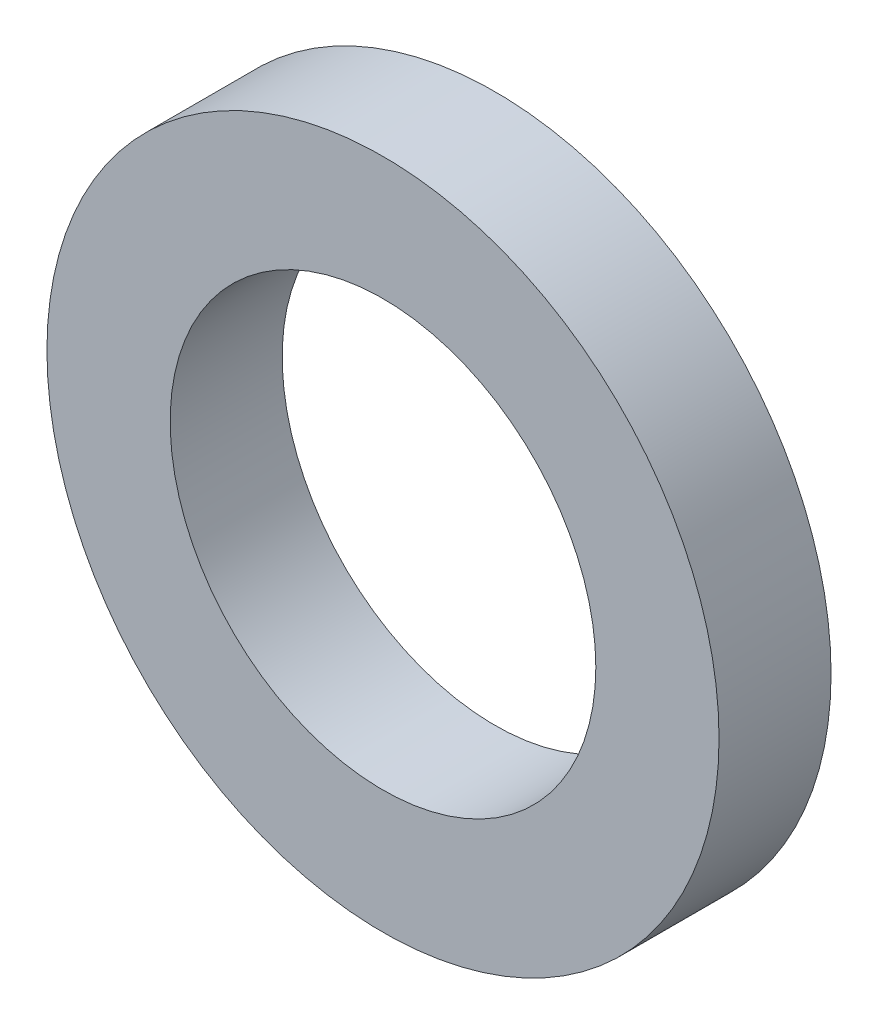
ISO-10303-21;
HEADER;
FILE_DESCRIPTION(('STEP AP214'),'2;1');
FILE_NAME('part.step','',(''),(''),'','','');
FILE_SCHEMA(('AUTOMOTIVE_DESIGN { 1 0 10303 214 1 1 1 1 }'));
ENDSEC;
DATA;
#1=APPLICATION_CONTEXT('core data for automotive mechanical design processes');
#2=APPLICATION_PROTOCOL_DEFINITION('international standard','automotive_design',2000,#1);
#3=PRODUCT_CONTEXT('',#1,'mechanical');
#4=PRODUCT('Part','Part','',(#3));
#5=PRODUCT_RELATED_PRODUCT_CATEGORY('part','',(#4));
#6=PRODUCT_DEFINITION_FORMATION('','',#4);
#7=PRODUCT_DEFINITION_CONTEXT('part definition',#1,'design');
#8=PRODUCT_DEFINITION('design','',#6,#7);
#9=PRODUCT_DEFINITION_SHAPE('','',#8);
#10=(LENGTH_UNIT() NAMED_UNIT(*) SI_UNIT(.MILLI.,.METRE.));
#11=(NAMED_UNIT(*) PLANE_ANGLE_UNIT() SI_UNIT($,.RADIAN.));
#12=(NAMED_UNIT(*) SI_UNIT($,.STERADIAN.) SOLID_ANGLE_UNIT());
#13=UNCERTAINTY_MEASURE_WITH_UNIT(LENGTH_MEASURE(1.E-05),#10,'distance_accuracy_value','');
#14=(GEOMETRIC_REPRESENTATION_CONTEXT(3) GLOBAL_UNCERTAINTY_ASSIGNED_CONTEXT((#13)) GLOBAL_UNIT_ASSIGNED_CONTEXT((#10,
#11,#12)) REPRESENTATION_CONTEXT('',''));
#15=CARTESIAN_POINT('',(0.,0.,0.));
#16=DIRECTION('',(0.,0.,1.));
#17=DIRECTION('',(1.,0.,0.));
#18=AXIS2_PLACEMENT_3D('',#15,#16,#17);
#19=CARTESIAN_POINT('',(0.,0.,1.25));
#20=DIRECTION('',(0.,0.,1.));
#21=DIRECTION('',(1.,0.,0.));
#22=AXIS2_PLACEMENT_3D('',#19,#20,#21);
#23=PLANE('',#22);
#24=CARTESIAN_POINT('',(0.,0.,1.25));
#25=DIRECTION('',(0.,0.,1.));
#26=DIRECTION('',(1.,0.,0.));
#27=AXIS2_PLACEMENT_3D('',#24,#25,#26);
#28=CIRCLE('',#27,4.5);
#29=CARTESIAN_POINT('',(4.5,0.,1.25));
#30=VERTEX_POINT('',#29);
#31=EDGE_CURVE('E10',#30,#30,#28,.T.);
#32=ORIENTED_EDGE('',*,*,#31,.T.);
#33=EDGE_LOOP('',(#32));
#34=FACE_BOUND('',#33,.T.);
#35=CARTESIAN_POINT('',(0.,0.,1.25));
#36=DIRECTION('',(0.,0.,1.));
#37=DIRECTION('',(1.,0.,0.));
#38=AXIS2_PLACEMENT_3D('',#35,#36,#37);
#39=CIRCLE('',#38,2.85);
#40=CARTESIAN_POINT('',(2.85,0.,1.25));
#41=VERTEX_POINT('',#40);
#42=EDGE_CURVE('E44',#41,#41,#39,.T.);
#43=ORIENTED_EDGE('',*,*,#42,.F.);
#44=EDGE_LOOP('',(#43));
#45=FACE_BOUND('',#44,.T.);
#46=ADVANCED_FACE('F33',(#34,#45),#23,.T.);
#47=CARTESIAN_POINT('',(0.,0.,-0.25));
#48=DIRECTION('',(0.,0.,1.));
#49=DIRECTION('',(1.,0.,0.));
#50=AXIS2_PLACEMENT_3D('',#47,#48,#49);
#51=PLANE('',#50);
#52=CARTESIAN_POINT('',(0.,0.,-0.25));
#53=DIRECTION('',(0.,0.,1.));
#54=DIRECTION('',(1.,0.,0.));
#55=AXIS2_PLACEMENT_3D('',#52,#53,#54);
#56=CIRCLE('',#55,4.5);
#57=CARTESIAN_POINT('',(4.5,0.,-0.25));
#58=VERTEX_POINT('',#57);
#59=EDGE_CURVE('E37',#58,#58,#56,.T.);
#60=ORIENTED_EDGE('',*,*,#59,.F.);
#61=EDGE_LOOP('',(#60));
#62=FACE_BOUND('',#61,.T.);
#63=CARTESIAN_POINT('',(0.,0.,-0.25));
#64=DIRECTION('',(0.,0.,1.));
#65=DIRECTION('',(1.,0.,0.));
#66=AXIS2_PLACEMENT_3D('',#63,#64,#65);
#67=CIRCLE('',#66,2.85);
#68=CARTESIAN_POINT('',(2.85,0.,-0.25));
#69=VERTEX_POINT('',#68);
#70=EDGE_CURVE('E46',#69,#69,#67,.T.);
#71=ORIENTED_EDGE('',*,*,#70,.T.);
#72=EDGE_LOOP('',(#71));
#73=FACE_BOUND('',#72,.T.);
#74=ADVANCED_FACE('F56',(#62,#73),#51,.F.);
#75=CARTESIAN_POINT('',(0.,0.,1.25));
#76=DIRECTION('',(0.,0.,-1.));
#77=DIRECTION('',(-1.,0.,0.));
#78=AXIS2_PLACEMENT_3D('',#75,#76,#77);
#79=CYLINDRICAL_SURFACE('',#78,4.5);
#80=ORIENTED_EDGE('',*,*,#31,.F.);
#81=EDGE_LOOP('',(#80));
#82=FACE_BOUND('',#81,.T.);
#83=ORIENTED_EDGE('',*,*,#59,.T.);
#84=EDGE_LOOP('',(#83));
#85=FACE_BOUND('',#84,.T.);
#86=ADVANCED_FACE('F35',(#82,#85),#79,.T.);
#87=CARTESIAN_POINT('',(0.,0.,1.25));
#88=DIRECTION('',(0.,0.,-1.));
#89=DIRECTION('',(-1.,0.,0.));
#90=AXIS2_PLACEMENT_3D('',#87,#88,#89);
#91=CYLINDRICAL_SURFACE('',#90,2.85);
#92=ORIENTED_EDGE('',*,*,#42,.T.);
#93=EDGE_LOOP('',(#92));
#94=FACE_BOUND('',#93,.T.);
#95=ORIENTED_EDGE('',*,*,#70,.F.);
#96=EDGE_LOOP('',(#95));
#97=FACE_BOUND('',#96,.T.);
#98=ADVANCED_FACE('F52',(#94,#97),#91,.F.);
#99=CLOSED_SHELL('',(#46,#74,#86,#98));
#100=MANIFOLD_SOLID_BREP('B2',#99);
#101=ADVANCED_BREP_SHAPE_REPRESENTATION('',(#18,#100),#14);
#102=SHAPE_DEFINITION_REPRESENTATION(#9,#101);
ENDSEC;
END-ISO-10303-21;
